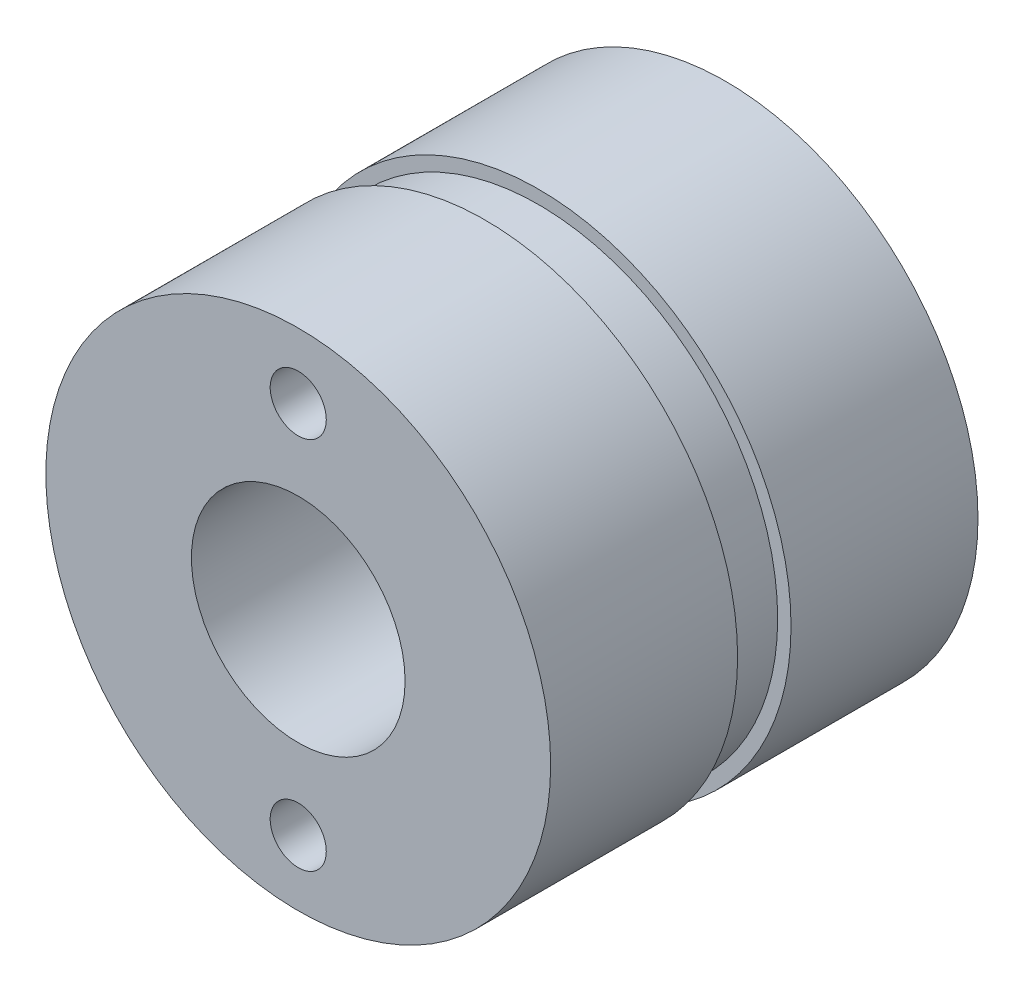
ISO-10303-21;
HEADER;
FILE_DESCRIPTION(('STEP AP214'),'2;1');
FILE_NAME('part.step','',(''),(''),'','','');
FILE_SCHEMA(('AUTOMOTIVE_DESIGN { 1 0 10303 214 1 1 1 1 }'));
ENDSEC;
DATA;
#1=APPLICATION_CONTEXT('core data for automotive mechanical design processes');
#2=APPLICATION_PROTOCOL_DEFINITION('international standard','automotive_design',2000,#1);
#3=PRODUCT_CONTEXT('',#1,'mechanical');
#4=PRODUCT('Part','Part','',(#3));
#5=PRODUCT_RELATED_PRODUCT_CATEGORY('part','',(#4));
#6=PRODUCT_DEFINITION_FORMATION('','',#4);
#7=PRODUCT_DEFINITION_CONTEXT('part definition',#1,'design');
#8=PRODUCT_DEFINITION('design','',#6,#7);
#9=PRODUCT_DEFINITION_SHAPE('','',#8);
#10=(LENGTH_UNIT() NAMED_UNIT(*) SI_UNIT(.MILLI.,.METRE.));
#11=(NAMED_UNIT(*) PLANE_ANGLE_UNIT() SI_UNIT($,.RADIAN.));
#12=(NAMED_UNIT(*) SI_UNIT($,.STERADIAN.) SOLID_ANGLE_UNIT());
#13=UNCERTAINTY_MEASURE_WITH_UNIT(LENGTH_MEASURE(1.E-05),#10,'distance_accuracy_value','');
#14=(GEOMETRIC_REPRESENTATION_CONTEXT(3) GLOBAL_UNCERTAINTY_ASSIGNED_CONTEXT((#13)) GLOBAL_UNIT_ASSIGNED_CONTEXT((#10,
#11,#12)) REPRESENTATION_CONTEXT('',''));
#15=CARTESIAN_POINT('',(0.,0.,0.));
#16=DIRECTION('',(0.,0.,1.));
#17=DIRECTION('',(1.,0.,0.));
#18=AXIS2_PLACEMENT_3D('',#15,#16,#17);
#19=CARTESIAN_POINT('',(0.,0.,0.));
#20=DIRECTION('',(0.,0.,1.));
#21=DIRECTION('',(1.,0.,0.));
#22=AXIS2_PLACEMENT_3D('',#19,#20,#21);
#23=PLANE('',#22);
#24=CARTESIAN_POINT('',(0.,-7.,0.));
#25=DIRECTION('',(0.,0.,-1.));
#26=DIRECTION('',(-1.,0.,0.));
#27=AXIS2_PLACEMENT_3D('',#24,#25,#26);
#28=CIRCLE('',#27,1.04999999999999);
#29=CARTESIAN_POINT('',(-1.04999999999999,-7.,0.));
#30=VERTEX_POINT('',#29);
#31=EDGE_CURVE('E78',#30,#30,#28,.T.);
#32=ORIENTED_EDGE('',*,*,#31,.F.);
#33=EDGE_LOOP('',(#32));
#34=FACE_BOUND('',#33,.T.);
#35=CARTESIAN_POINT('',(0.,0.,0.));
#36=DIRECTION('',(0.,0.,1.));
#37=DIRECTION('',(1.,0.,0.));
#38=AXIS2_PLACEMENT_3D('',#35,#36,#37);
#39=CIRCLE('',#38,4.);
#40=CARTESIAN_POINT('',(4.,0.,0.));
#41=VERTEX_POINT('',#40);
#42=EDGE_CURVE('E102',#41,#41,#39,.T.);
#43=ORIENTED_EDGE('',*,*,#42,.T.);
#44=EDGE_LOOP('',(#43));
#45=FACE_BOUND('',#44,.T.);
#46=CARTESIAN_POINT('',(0.,0.,0.));
#47=DIRECTION('',(0.,0.,1.));
#48=DIRECTION('',(1.,0.,0.));
#49=AXIS2_PLACEMENT_3D('',#46,#47,#48);
#50=CIRCLE('',#49,9.45);
#51=CARTESIAN_POINT('',(9.45,0.,0.));
#52=VERTEX_POINT('',#51);
#53=EDGE_CURVE('E49',#52,#52,#50,.T.);
#54=ORIENTED_EDGE('',*,*,#53,.F.);
#55=EDGE_LOOP('',(#54));
#56=FACE_BOUND('',#55,.T.);
#57=CARTESIAN_POINT('',(0.,7.,0.));
#58=DIRECTION('',(0.,0.,-1.));
#59=DIRECTION('',(-1.,0.,0.));
#60=AXIS2_PLACEMENT_3D('',#57,#58,#59);
#61=CIRCLE('',#60,1.04999999999999);
#62=CARTESIAN_POINT('',(-1.04999999999999,7.,0.));
#63=VERTEX_POINT('',#62);
#64=EDGE_CURVE('E79',#63,#63,#61,.T.);
#65=ORIENTED_EDGE('',*,*,#64,.F.);
#66=EDGE_LOOP('',(#65));
#67=FACE_BOUND('',#66,.T.);
#68=ADVANCED_FACE('F45',(#34,#45,#56,#67),#23,.F.);
#69=CARTESIAN_POINT('',(0.,0.,7.));
#70=DIRECTION('',(0.,0.,-1.));
#71=DIRECTION('',(-1.,0.,0.));
#72=AXIS2_PLACEMENT_3D('',#69,#70,#71);
#73=CYLINDRICAL_SURFACE('',#72,9.45);
#74=CARTESIAN_POINT('',(0.,0.,7.));
#75=DIRECTION('',(0.,0.,1.));
#76=DIRECTION('',(1.,0.,0.));
#77=AXIS2_PLACEMENT_3D('',#74,#75,#76);
#78=CIRCLE('',#77,9.45);
#79=CARTESIAN_POINT('',(9.45,0.,7.));
#80=VERTEX_POINT('',#79);
#81=EDGE_CURVE('E54',#80,#80,#78,.T.);
#82=ORIENTED_EDGE('',*,*,#81,.F.);
#83=EDGE_LOOP('',(#82));
#84=FACE_BOUND('',#83,.T.);
#85=ORIENTED_EDGE('',*,*,#53,.T.);
#86=EDGE_LOOP('',(#85));
#87=FACE_BOUND('',#86,.T.);
#88=ADVANCED_FACE('F47',(#84,#87),#73,.T.);
#89=CARTESIAN_POINT('',(0.,0.,7.));
#90=DIRECTION('',(0.,0.,1.));
#91=DIRECTION('',(1.,0.,0.));
#92=AXIS2_PLACEMENT_3D('',#89,#90,#91);
#93=PLANE('',#92);
#94=CARTESIAN_POINT('',(0.,0.,7.));
#95=DIRECTION('',(0.,0.,1.));
#96=DIRECTION('',(1.,0.,0.));
#97=AXIS2_PLACEMENT_3D('',#94,#95,#96);
#98=CIRCLE('',#97,8.95);
#99=CARTESIAN_POINT('',(8.95,0.,7.));
#100=VERTEX_POINT('',#99);
#101=EDGE_CURVE('E11',#100,#100,#98,.T.);
#102=ORIENTED_EDGE('',*,*,#101,.F.);
#103=EDGE_LOOP('',(#102));
#104=FACE_BOUND('',#103,.T.);
#105=ORIENTED_EDGE('',*,*,#81,.T.);
#106=EDGE_LOOP('',(#105));
#107=FACE_BOUND('',#106,.T.);
#108=ADVANCED_FACE('F172',(#104,#107),#93,.T.);
#109=CARTESIAN_POINT('',(0.,0.,9.));
#110=DIRECTION('',(0.,0.,-1.));
#111=DIRECTION('',(-1.,0.,0.));
#112=AXIS2_PLACEMENT_3D('',#109,#110,#111);
#113=CYLINDRICAL_SURFACE('',#112,8.95);
#114=CARTESIAN_POINT('',(0.,0.,9.));
#115=DIRECTION('',(0.,0.,1.));
#116=DIRECTION('',(1.,0.,0.));
#117=AXIS2_PLACEMENT_3D('',#114,#115,#116);
#118=CIRCLE('',#117,8.95);
#119=CARTESIAN_POINT('',(8.95,0.,9.));
#120=VERTEX_POINT('',#119);
#121=EDGE_CURVE('E111',#120,#120,#118,.T.);
#122=ORIENTED_EDGE('',*,*,#121,.F.);
#123=EDGE_LOOP('',(#122));
#124=FACE_BOUND('',#123,.T.);
#125=ORIENTED_EDGE('',*,*,#101,.T.);
#126=EDGE_LOOP('',(#125));
#127=FACE_BOUND('',#126,.T.);
#128=ADVANCED_FACE('F168',(#124,#127),#113,.T.);
#129=CARTESIAN_POINT('',(0.,0.,16.));
#130=DIRECTION('',(0.,0.,-1.));
#131=DIRECTION('',(-1.,0.,0.));
#132=AXIS2_PLACEMENT_3D('',#129,#130,#131);
#133=CYLINDRICAL_SURFACE('',#132,9.45);
#134=CARTESIAN_POINT('',(0.,0.,16.));
#135=DIRECTION('',(0.,0.,1.));
#136=DIRECTION('',(1.,0.,0.));
#137=AXIS2_PLACEMENT_3D('',#134,#135,#136);
#138=CIRCLE('',#137,9.45);
#139=CARTESIAN_POINT('',(9.45,0.,16.));
#140=VERTEX_POINT('',#139);
#141=EDGE_CURVE('E108',#140,#140,#138,.T.);
#142=ORIENTED_EDGE('',*,*,#141,.F.);
#143=EDGE_LOOP('',(#142));
#144=FACE_BOUND('',#143,.T.);
#145=CARTESIAN_POINT('',(0.,0.,9.));
#146=DIRECTION('',(0.,0.,1.));
#147=DIRECTION('',(1.,0.,0.));
#148=AXIS2_PLACEMENT_3D('',#145,#146,#147);
#149=CIRCLE('',#148,9.45);
#150=CARTESIAN_POINT('',(9.45,0.,9.));
#151=VERTEX_POINT('',#150);
#152=EDGE_CURVE('E105',#151,#151,#149,.T.);
#153=ORIENTED_EDGE('',*,*,#152,.T.);
#154=EDGE_LOOP('',(#153));
#155=FACE_BOUND('',#154,.T.);
#156=ADVANCED_FACE('F161',(#144,#155),#133,.T.);
#157=CARTESIAN_POINT('',(0.,0.,16.));
#158=DIRECTION('',(0.,0.,1.));
#159=DIRECTION('',(1.,0.,0.));
#160=AXIS2_PLACEMENT_3D('',#157,#158,#159);
#161=PLANE('',#160);
#162=CARTESIAN_POINT('',(0.,-7.,16.));
#163=DIRECTION('',(0.,0.,1.));
#164=DIRECTION('',(1.,0.,0.));
#165=AXIS2_PLACEMENT_3D('',#162,#163,#164);
#166=CIRCLE('',#165,1.04999999999999);
#167=CARTESIAN_POINT('',(1.04999999999999,-7.,16.));
#168=VERTEX_POINT('',#167);
#169=EDGE_CURVE('E89',#168,#168,#166,.T.);
#170=ORIENTED_EDGE('',*,*,#169,.F.);
#171=EDGE_LOOP('',(#170));
#172=FACE_BOUND('',#171,.T.);
#173=CARTESIAN_POINT('',(0.,7.,16.));
#174=DIRECTION('',(0.,0.,1.));
#175=DIRECTION('',(1.,0.,0.));
#176=AXIS2_PLACEMENT_3D('',#173,#174,#175);
#177=CIRCLE('',#176,1.04999999999999);
#178=CARTESIAN_POINT('',(1.04999999999999,7.,16.));
#179=VERTEX_POINT('',#178);
#180=EDGE_CURVE('E95',#179,#179,#177,.T.);
#181=ORIENTED_EDGE('',*,*,#180,.F.);
#182=EDGE_LOOP('',(#181));
#183=FACE_BOUND('',#182,.T.);
#184=CARTESIAN_POINT('',(0.,0.,16.));
#185=DIRECTION('',(0.,0.,1.));
#186=DIRECTION('',(1.,0.,0.));
#187=AXIS2_PLACEMENT_3D('',#184,#185,#186);
#188=CIRCLE('',#187,4.);
#189=CARTESIAN_POINT('',(4.,0.,16.));
#190=VERTEX_POINT('',#189);
#191=EDGE_CURVE('E101',#190,#190,#188,.T.);
#192=ORIENTED_EDGE('',*,*,#191,.F.);
#193=EDGE_LOOP('',(#192));
#194=FACE_BOUND('',#193,.T.);
#195=ORIENTED_EDGE('',*,*,#141,.T.);
#196=EDGE_LOOP('',(#195));
#197=FACE_BOUND('',#196,.T.);
#198=ADVANCED_FACE('F158',(#172,#183,#194,#197),#161,.T.);
#199=CARTESIAN_POINT('',(0.,0.,9.));
#200=DIRECTION('',(0.,0.,1.));
#201=DIRECTION('',(1.,0.,0.));
#202=AXIS2_PLACEMENT_3D('',#199,#200,#201);
#203=PLANE('',#202);
#204=ORIENTED_EDGE('',*,*,#121,.T.);
#205=EDGE_LOOP('',(#204));
#206=FACE_BOUND('',#205,.T.);
#207=ORIENTED_EDGE('',*,*,#152,.F.);
#208=EDGE_LOOP('',(#207));
#209=FACE_BOUND('',#208,.T.);
#210=ADVANCED_FACE('F156',(#206,#209),#203,.F.);
#211=CARTESIAN_POINT('',(0.,0.,0.));
#212=DIRECTION('',(0.,0.,1.));
#213=DIRECTION('',(1.,0.,0.));
#214=AXIS2_PLACEMENT_3D('',#211,#212,#213);
#215=CYLINDRICAL_SURFACE('',#214,4.);
#216=ORIENTED_EDGE('',*,*,#42,.F.);
#217=EDGE_LOOP('',(#216));
#218=FACE_BOUND('',#217,.T.);
#219=ORIENTED_EDGE('',*,*,#191,.T.);
#220=EDGE_LOOP('',(#219));
#221=FACE_BOUND('',#220,.T.);
#222=ADVANCED_FACE('F153',(#218,#221),#215,.F.);
#223=CARTESIAN_POINT('',(0.,7.,9.));
#224=DIRECTION('',(0.,0.,1.));
#225=DIRECTION('',(1.,0.,0.));
#226=AXIS2_PLACEMENT_3D('',#223,#224,#225);
#227=CONICAL_SURFACE('',#226,1.05,1.02974425867665);
#228=CARTESIAN_POINT('',(0.,7.,8.36909635002106));
#229=VERTEX_POINT('',#228);
#230=VERTEX_LOOP('',#229);
#231=FACE_BOUND('',#230,.T.);
#232=CARTESIAN_POINT('',(0.,7.,9.));
#233=DIRECTION('',(0.,0.,1.));
#234=DIRECTION('',(1.,0.,0.));
#235=AXIS2_PLACEMENT_3D('',#232,#233,#234);
#236=CIRCLE('',#235,1.05);
#237=CARTESIAN_POINT('',(1.05,7.,9.));
#238=VERTEX_POINT('',#237);
#239=EDGE_CURVE('E98',#238,#238,#236,.T.);
#240=ORIENTED_EDGE('',*,*,#239,.T.);
#241=EDGE_LOOP('',(#240));
#242=FACE_BOUND('',#241,.T.);
#243=ADVANCED_FACE('F149',(#231,#242),#227,.F.);
#244=CARTESIAN_POINT('',(0.,7.,16.));
#245=DIRECTION('',(0.,0.,1.));
#246=DIRECTION('',(1.,0.,0.));
#247=AXIS2_PLACEMENT_3D('',#244,#245,#246);
#248=CYLINDRICAL_SURFACE('',#247,1.04999999999999);
#249=ORIENTED_EDGE('',*,*,#239,.F.);
#250=EDGE_LOOP('',(#249));
#251=FACE_BOUND('',#250,.T.);
#252=ORIENTED_EDGE('',*,*,#180,.T.);
#253=EDGE_LOOP('',(#252));
#254=FACE_BOUND('',#253,.T.);
#255=ADVANCED_FACE('F146',(#251,#254),#248,.F.);
#256=CARTESIAN_POINT('',(0.,-7.,9.));
#257=DIRECTION('',(0.,0.,1.));
#258=DIRECTION('',(1.,0.,0.));
#259=AXIS2_PLACEMENT_3D('',#256,#257,#258);
#260=CONICAL_SURFACE('',#259,1.05,1.02974425867665);
#261=CARTESIAN_POINT('',(0.,-7.,8.36909635002106));
#262=VERTEX_POINT('',#261);
#263=VERTEX_LOOP('',#262);
#264=FACE_BOUND('',#263,.T.);
#265=CARTESIAN_POINT('',(0.,-7.,9.));
#266=DIRECTION('',(0.,0.,1.));
#267=DIRECTION('',(1.,0.,0.));
#268=AXIS2_PLACEMENT_3D('',#265,#266,#267);
#269=CIRCLE('',#268,1.05);
#270=CARTESIAN_POINT('',(1.05,-7.,9.));
#271=VERTEX_POINT('',#270);
#272=EDGE_CURVE('E92',#271,#271,#269,.T.);
#273=ORIENTED_EDGE('',*,*,#272,.T.);
#274=EDGE_LOOP('',(#273));
#275=FACE_BOUND('',#274,.T.);
#276=ADVANCED_FACE('F142',(#264,#275),#260,.F.);
#277=CARTESIAN_POINT('',(0.,-7.,16.));
#278=DIRECTION('',(0.,0.,1.));
#279=DIRECTION('',(1.,0.,0.));
#280=AXIS2_PLACEMENT_3D('',#277,#278,#279);
#281=CYLINDRICAL_SURFACE('',#280,1.04999999999999);
#282=ORIENTED_EDGE('',*,*,#272,.F.);
#283=EDGE_LOOP('',(#282));
#284=FACE_BOUND('',#283,.T.);
#285=ORIENTED_EDGE('',*,*,#169,.T.);
#286=EDGE_LOOP('',(#285));
#287=FACE_BOUND('',#286,.T.);
#288=ADVANCED_FACE('F138',(#284,#287),#281,.F.);
#289=CARTESIAN_POINT('',(0.,-7.,6.99999999999999));
#290=DIRECTION('',(0.,0.,-1.));
#291=DIRECTION('',(-1.,0.,0.));
#292=AXIS2_PLACEMENT_3D('',#289,#290,#291);
#293=CONICAL_SURFACE('',#292,1.04999999999999,1.02974425867665);
#294=CARTESIAN_POINT('',(0.,-7.,7.63090364997893));
#295=VERTEX_POINT('',#294);
#296=VERTEX_LOOP('',#295);
#297=FACE_BOUND('',#296,.T.);
#298=CARTESIAN_POINT('',(0.,-7.,6.99999999999999));
#299=DIRECTION('',(0.,0.,-1.));
#300=DIRECTION('',(-1.,0.,0.));
#301=AXIS2_PLACEMENT_3D('',#298,#299,#300);
#302=CIRCLE('',#301,1.04999999999999);
#303=CARTESIAN_POINT('',(-1.04999999999999,-7.,6.99999999999999));
#304=VERTEX_POINT('',#303);
#305=EDGE_CURVE('E82',#304,#304,#302,.T.);
#306=ORIENTED_EDGE('',*,*,#305,.T.);
#307=EDGE_LOOP('',(#306));
#308=FACE_BOUND('',#307,.T.);
#309=ADVANCED_FACE('F134',(#297,#308),#293,.F.);
#310=CARTESIAN_POINT('',(0.,-7.,0.));
#311=DIRECTION('',(0.,0.,-1.));
#312=DIRECTION('',(-1.,0.,0.));
#313=AXIS2_PLACEMENT_3D('',#310,#311,#312);
#314=CYLINDRICAL_SURFACE('',#313,1.04999999999999);
#315=ORIENTED_EDGE('',*,*,#305,.F.);
#316=EDGE_LOOP('',(#315));
#317=FACE_BOUND('',#316,.T.);
#318=ORIENTED_EDGE('',*,*,#31,.T.);
#319=EDGE_LOOP('',(#318));
#320=FACE_BOUND('',#319,.T.);
#321=ADVANCED_FACE('F72',(#317,#320),#314,.F.);
#322=CARTESIAN_POINT('',(0.,7.,6.99999999999999));
#323=DIRECTION('',(0.,0.,-1.));
#324=DIRECTION('',(-1.,0.,0.));
#325=AXIS2_PLACEMENT_3D('',#322,#323,#324);
#326=CONICAL_SURFACE('',#325,1.04999999999999,1.02974425867665);
#327=CARTESIAN_POINT('',(0.,7.,7.63090364997893));
#328=VERTEX_POINT('',#327);
#329=VERTEX_LOOP('',#328);
#330=FACE_BOUND('',#329,.T.);
#331=CARTESIAN_POINT('',(0.,7.,6.99999999999999));
#332=DIRECTION('',(0.,0.,-1.));
#333=DIRECTION('',(-1.,0.,0.));
#334=AXIS2_PLACEMENT_3D('',#331,#332,#333);
#335=CIRCLE('',#334,1.04999999999999);
#336=CARTESIAN_POINT('',(-1.04999999999999,7.,6.99999999999999));
#337=VERTEX_POINT('',#336);
#338=EDGE_CURVE('E76',#337,#337,#335,.T.);
#339=ORIENTED_EDGE('',*,*,#338,.T.);
#340=EDGE_LOOP('',(#339));
#341=FACE_BOUND('',#340,.T.);
#342=ADVANCED_FACE('F68',(#330,#341),#326,.F.);
#343=CARTESIAN_POINT('',(0.,7.,0.));
#344=DIRECTION('',(0.,0.,-1.));
#345=DIRECTION('',(-1.,0.,0.));
#346=AXIS2_PLACEMENT_3D('',#343,#344,#345);
#347=CYLINDRICAL_SURFACE('',#346,1.04999999999999);
#348=ORIENTED_EDGE('',*,*,#338,.F.);
#349=EDGE_LOOP('',(#348));
#350=FACE_BOUND('',#349,.T.);
#351=ORIENTED_EDGE('',*,*,#64,.T.);
#352=EDGE_LOOP('',(#351));
#353=FACE_BOUND('',#352,.T.);
#354=ADVANCED_FACE('F71',(#350,#353),#347,.F.);
#355=CLOSED_SHELL('',(#68,#88,#108,#128,#156,#198,#210,#222,#243,#255,#276,#288,#309,#321,#342,#354));
#356=MANIFOLD_SOLID_BREP('B2',#355);
#357=ADVANCED_BREP_SHAPE_REPRESENTATION('',(#18,#356),#14);
#358=SHAPE_DEFINITION_REPRESENTATION(#9,#357);
ENDSEC;
END-ISO-10303-21;
